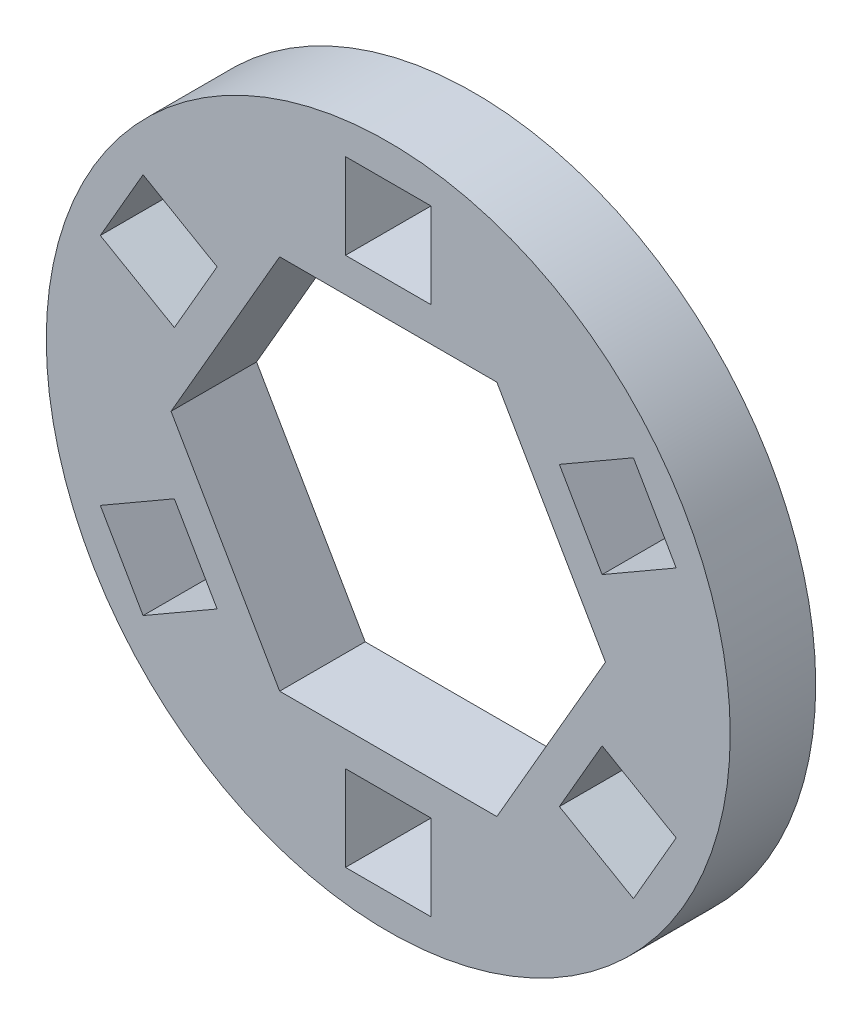
ISO-10303-21;
HEADER;
FILE_DESCRIPTION(('STEP AP214'),'2;1');
FILE_NAME('part.step','',(''),(''),'','','');
FILE_SCHEMA(('AUTOMOTIVE_DESIGN { 1 0 10303 214 1 1 1 1 }'));
ENDSEC;
DATA;
#1=APPLICATION_CONTEXT('core data for automotive mechanical design processes');
#2=APPLICATION_PROTOCOL_DEFINITION('international standard','automotive_design',2000,#1);
#3=PRODUCT_CONTEXT('',#1,'mechanical');
#4=PRODUCT('Part','Part','',(#3));
#5=PRODUCT_RELATED_PRODUCT_CATEGORY('part','',(#4));
#6=PRODUCT_DEFINITION_FORMATION('','',#4);
#7=PRODUCT_DEFINITION_CONTEXT('part definition',#1,'design');
#8=PRODUCT_DEFINITION('design','',#6,#7);
#9=PRODUCT_DEFINITION_SHAPE('','',#8);
#10=(LENGTH_UNIT() NAMED_UNIT(*) SI_UNIT(.MILLI.,.METRE.));
#11=(NAMED_UNIT(*) PLANE_ANGLE_UNIT() SI_UNIT($,.RADIAN.));
#12=(NAMED_UNIT(*) SI_UNIT($,.STERADIAN.) SOLID_ANGLE_UNIT());
#13=UNCERTAINTY_MEASURE_WITH_UNIT(LENGTH_MEASURE(1.E-05),#10,'distance_accuracy_value','');
#14=(GEOMETRIC_REPRESENTATION_CONTEXT(3) GLOBAL_UNCERTAINTY_ASSIGNED_CONTEXT((#13)) GLOBAL_UNIT_ASSIGNED_CONTEXT((#10,
#11,#12)) REPRESENTATION_CONTEXT('',''));
#15=CARTESIAN_POINT('',(0.,0.,0.));
#16=DIRECTION('',(0.,0.,1.));
#17=DIRECTION('',(1.,0.,0.));
#18=AXIS2_PLACEMENT_3D('',#15,#16,#17);
#19=CARTESIAN_POINT('',(0.,0.,5.));
#20=DIRECTION('',(0.,0.,1.));
#21=DIRECTION('',(1.,0.,0.));
#22=AXIS2_PLACEMENT_3D('',#19,#20,#21);
#23=PLANE('',#22);
#24=CARTESIAN_POINT('',(0.,0.,5.));
#25=DIRECTION('',(0.,0.,1.));
#26=DIRECTION('',(1.,0.,0.));
#27=AXIS2_PLACEMENT_3D('',#24,#25,#26);
#28=CIRCLE('',#27,20.);
#29=CARTESIAN_POINT('',(20.,0.,5.));
#30=VERTEX_POINT('',#29);
#31=EDGE_CURVE('E11',#30,#30,#28,.T.);
#32=ORIENTED_EDGE('',*,*,#31,.T.);
#33=EDGE_LOOP('',(#32));
#34=FACE_BOUND('',#33,.T.);
#35=DIRECTION('',(-0.5,0.866025403784438,0.));
#36=VECTOR('',#35,1.);
#37=CARTESIAN_POINT('',(12.7017059221718,0.,5.));
#38=LINE('',#37,#36);
#39=CARTESIAN_POINT('',(12.7017059221718,0.,5.));
#40=VERTEX_POINT('',#39);
#41=CARTESIAN_POINT('',(6.35085296108588,11.,5.));
#42=VERTEX_POINT('',#41);
#43=EDGE_CURVE('E422',#40,#42,#38,.T.);
#44=ORIENTED_EDGE('',*,*,#43,.F.);
#45=DIRECTION('',(0.5,0.866025403784439,0.));
#46=VECTOR('',#45,1.);
#47=CARTESIAN_POINT('',(6.35085296108588,-11.,5.));
#48=LINE('',#47,#46);
#49=CARTESIAN_POINT('',(6.35085296108588,-11.,5.));
#50=VERTEX_POINT('',#49);
#51=EDGE_CURVE('E420',#50,#40,#48,.T.);
#52=ORIENTED_EDGE('',*,*,#51,.F.);
#53=DIRECTION('',(1.,0.,0.));
#54=VECTOR('',#53,1.);
#55=CARTESIAN_POINT('',(-6.35085296108588,-11.,5.));
#56=LINE('',#55,#54);
#57=CARTESIAN_POINT('',(-6.35085296108588,-11.,5.));
#58=VERTEX_POINT('',#57);
#59=EDGE_CURVE('E432',#58,#50,#56,.T.);
#60=ORIENTED_EDGE('',*,*,#59,.F.);
#61=DIRECTION('',(0.5,-0.866025403784438,0.));
#62=VECTOR('',#61,1.);
#63=CARTESIAN_POINT('',(-12.7017059221718,0.,5.));
#64=LINE('',#63,#62);
#65=CARTESIAN_POINT('',(-12.7017059221718,0.,5.));
#66=VERTEX_POINT('',#65);
#67=EDGE_CURVE('E429',#66,#58,#64,.T.);
#68=ORIENTED_EDGE('',*,*,#67,.F.);
#69=DIRECTION('',(-0.5,-0.866025403784438,0.));
#70=VECTOR('',#69,1.);
#71=CARTESIAN_POINT('',(-6.35085296108588,11.,5.));
#72=LINE('',#71,#70);
#73=CARTESIAN_POINT('',(-6.35085296108588,11.,5.));
#74=VERTEX_POINT('',#73);
#75=EDGE_CURVE('E427',#74,#66,#72,.T.);
#76=ORIENTED_EDGE('',*,*,#75,.F.);
#77=DIRECTION('',(-1.,0.,0.));
#78=VECTOR('',#77,1.);
#79=CARTESIAN_POINT('',(6.35085296108588,11.,5.));
#80=LINE('',#79,#78);
#81=EDGE_CURVE('E425',#42,#74,#80,.T.);
#82=ORIENTED_EDGE('',*,*,#81,.F.);
#83=EDGE_LOOP('',(#44,#52,#60,#68,#76,#82));
#84=FACE_BOUND('',#83,.T.);
#85=DIRECTION('',(1.,0.,0.));
#86=VECTOR('',#85,1.);
#87=CARTESIAN_POINT('',(-2.5,13.,5.));
#88=LINE('',#87,#86);
#89=CARTESIAN_POINT('',(-2.5,13.,5.));
#90=VERTEX_POINT('',#89);
#91=CARTESIAN_POINT('',(2.5,13.,5.));
#92=VERTEX_POINT('',#91);
#93=EDGE_CURVE('E391',#90,#92,#88,.T.);
#94=ORIENTED_EDGE('',*,*,#93,.F.);
#95=DIRECTION('',(0.,-1.,0.));
#96=VECTOR('',#95,1.);
#97=CARTESIAN_POINT('',(-2.5,18.,5.));
#98=LINE('',#97,#96);
#99=CARTESIAN_POINT('',(-2.5,18.,5.));
#100=VERTEX_POINT('',#99);
#101=EDGE_CURVE('E389',#100,#90,#98,.T.);
#102=ORIENTED_EDGE('',*,*,#101,.F.);
#103=DIRECTION('',(-1.,0.,0.));
#104=VECTOR('',#103,1.);
#105=CARTESIAN_POINT('',(-2.5,18.,5.));
#106=LINE('',#105,#104);
#107=CARTESIAN_POINT('',(2.5,18.,5.));
#108=VERTEX_POINT('',#107);
#109=EDGE_CURVE('E397',#108,#100,#106,.T.);
#110=ORIENTED_EDGE('',*,*,#109,.F.);
#111=DIRECTION('',(0.,1.,0.));
#112=VECTOR('',#111,1.);
#113=CARTESIAN_POINT('',(2.5,18.,5.));
#114=LINE('',#113,#112);
#115=EDGE_CURVE('E394',#92,#108,#114,.T.);
#116=ORIENTED_EDGE('',*,*,#115,.F.);
#117=EDGE_LOOP('',(#94,#102,#110,#116));
#118=FACE_BOUND('',#117,.T.);
#119=DIRECTION('',(-0.866025403784439,-0.5,0.));
#120=VECTOR('',#119,1.);
#121=CARTESIAN_POINT('',(14.3384572681199,11.1650635094611,5.));
#122=LINE('',#121,#120);
#123=CARTESIAN_POINT('',(14.3384572681199,11.1650635094611,5.));
#124=VERTEX_POINT('',#123);
#125=CARTESIAN_POINT('',(10.0083302491977,8.6650635094611,5.));
#126=VERTEX_POINT('',#125);
#127=EDGE_CURVE('E360',#124,#126,#122,.T.);
#128=ORIENTED_EDGE('',*,*,#127,.F.);
#129=DIRECTION('',(-0.5,0.866025403784438,0.));
#130=VECTOR('',#129,1.);
#131=CARTESIAN_POINT('',(14.3384572681199,11.1650635094611,5.));
#132=LINE('',#131,#130);
#133=CARTESIAN_POINT('',(16.8384572681199,6.83493649053891,5.));
#134=VERTEX_POINT('',#133);
#135=EDGE_CURVE('E358',#134,#124,#132,.T.);
#136=ORIENTED_EDGE('',*,*,#135,.F.);
#137=DIRECTION('',(0.866025403784438,0.500000000000001,0.));
#138=VECTOR('',#137,1.);
#139=CARTESIAN_POINT('',(16.8384572681199,6.83493649053891,5.));
#140=LINE('',#139,#138);
#141=CARTESIAN_POINT('',(12.5083302491977,4.3349364905389,5.));
#142=VERTEX_POINT('',#141);
#143=EDGE_CURVE('E366',#142,#134,#140,.T.);
#144=ORIENTED_EDGE('',*,*,#143,.F.);
#145=DIRECTION('',(0.5,-0.866025403784438,0.));
#146=VECTOR('',#145,1.);
#147=CARTESIAN_POINT('',(10.0083302491977,8.6650635094611,5.));
#148=LINE('',#147,#146);
#149=EDGE_CURVE('E363',#126,#142,#148,.T.);
#150=ORIENTED_EDGE('',*,*,#149,.F.);
#151=EDGE_LOOP('',(#128,#136,#144,#150));
#152=FACE_BOUND('',#151,.T.);
#153=DIRECTION('',(-0.866025403784439,0.5,0.));
#154=VECTOR('',#153,1.);
#155=CARTESIAN_POINT('',(16.8384572681199,-6.8349364905389,5.));
#156=LINE('',#155,#154);
#157=CARTESIAN_POINT('',(16.8384572681199,-6.8349364905389,5.));
#158=VERTEX_POINT('',#157);
#159=CARTESIAN_POINT('',(12.5083302491977,-4.3349364905389,5.));
#160=VERTEX_POINT('',#159);
#161=EDGE_CURVE('E329',#158,#160,#156,.T.);
#162=ORIENTED_EDGE('',*,*,#161,.F.);
#163=DIRECTION('',(0.5,0.866025403784439,0.));
#164=VECTOR('',#163,1.);
#165=CARTESIAN_POINT('',(16.8384572681199,-6.8349364905389,5.));
#166=LINE('',#165,#164);
#167=CARTESIAN_POINT('',(14.3384572681199,-11.1650635094611,5.));
#168=VERTEX_POINT('',#167);
#169=EDGE_CURVE('E327',#168,#158,#166,.T.);
#170=ORIENTED_EDGE('',*,*,#169,.F.);
#171=DIRECTION('',(0.866025403784439,-0.499999999999999,0.));
#172=VECTOR('',#171,1.);
#173=CARTESIAN_POINT('',(14.3384572681199,-11.1650635094611,5.));
#174=LINE('',#173,#172);
#175=CARTESIAN_POINT('',(10.0083302491977,-8.6650635094611,5.));
#176=VERTEX_POINT('',#175);
#177=EDGE_CURVE('E335',#176,#168,#174,.T.);
#178=ORIENTED_EDGE('',*,*,#177,.F.);
#179=DIRECTION('',(-0.5,-0.866025403784439,0.));
#180=VECTOR('',#179,1.);
#181=CARTESIAN_POINT('',(12.5083302491977,-4.3349364905389,5.));
#182=LINE('',#181,#180);
#183=EDGE_CURVE('E332',#160,#176,#182,.T.);
#184=ORIENTED_EDGE('',*,*,#183,.F.);
#185=EDGE_LOOP('',(#162,#170,#178,#184));
#186=FACE_BOUND('',#185,.T.);
#187=DIRECTION('',(0.,1.,0.));
#188=VECTOR('',#187,1.);
#189=CARTESIAN_POINT('',(2.5,-18.,5.));
#190=LINE('',#189,#188);
#191=CARTESIAN_POINT('',(2.5,-18.,5.));
#192=VERTEX_POINT('',#191);
#193=CARTESIAN_POINT('',(2.5,-13.,5.));
#194=VERTEX_POINT('',#193);
#195=EDGE_CURVE('E298',#192,#194,#190,.T.);
#196=ORIENTED_EDGE('',*,*,#195,.F.);
#197=DIRECTION('',(1.,0.,0.));
#198=VECTOR('',#197,1.);
#199=CARTESIAN_POINT('',(2.5,-18.,5.));
#200=LINE('',#199,#198);
#201=CARTESIAN_POINT('',(-2.5,-18.,5.));
#202=VERTEX_POINT('',#201);
#203=EDGE_CURVE('E296',#202,#192,#200,.T.);
#204=ORIENTED_EDGE('',*,*,#203,.F.);
#205=DIRECTION('',(0.,-1.,0.));
#206=VECTOR('',#205,1.);
#207=CARTESIAN_POINT('',(-2.5,-18.,5.));
#208=LINE('',#207,#206);
#209=CARTESIAN_POINT('',(-2.5,-13.,5.));
#210=VERTEX_POINT('',#209);
#211=EDGE_CURVE('E304',#210,#202,#208,.T.);
#212=ORIENTED_EDGE('',*,*,#211,.F.);
#213=DIRECTION('',(-1.,0.,0.));
#214=VECTOR('',#213,1.);
#215=CARTESIAN_POINT('',(2.5,-13.,5.));
#216=LINE('',#215,#214);
#217=EDGE_CURVE('E301',#194,#210,#216,.T.);
#218=ORIENTED_EDGE('',*,*,#217,.F.);
#219=EDGE_LOOP('',(#196,#204,#212,#218));
#220=FACE_BOUND('',#219,.T.);
#221=DIRECTION('',(0.866025403784438,0.5,0.));
#222=VECTOR('',#221,1.);
#223=CARTESIAN_POINT('',(-14.3384572681199,-11.1650635094611,5.));
#224=LINE('',#223,#222);
#225=CARTESIAN_POINT('',(-14.3384572681199,-11.1650635094611,5.));
#226=VERTEX_POINT('',#225);
#227=CARTESIAN_POINT('',(-10.0083302491977,-8.6650635094611,5.));
#228=VERTEX_POINT('',#227);
#229=EDGE_CURVE('E267',#226,#228,#224,.T.);
#230=ORIENTED_EDGE('',*,*,#229,.F.);
#231=DIRECTION('',(0.5,-0.866025403784438,0.));
#232=VECTOR('',#231,1.);
#233=CARTESIAN_POINT('',(-14.3384572681199,-11.1650635094611,5.));
#234=LINE('',#233,#232);
#235=CARTESIAN_POINT('',(-16.8384572681199,-6.83493649053891,5.));
#236=VERTEX_POINT('',#235);
#237=EDGE_CURVE('E265',#236,#226,#234,.T.);
#238=ORIENTED_EDGE('',*,*,#237,.F.);
#239=DIRECTION('',(-0.866025403784438,-0.500000000000001,0.));
#240=VECTOR('',#239,1.);
#241=CARTESIAN_POINT('',(-16.8384572681199,-6.83493649053891,5.));
#242=LINE('',#241,#240);
#243=CARTESIAN_POINT('',(-12.5083302491977,-4.33493649053891,5.));
#244=VERTEX_POINT('',#243);
#245=EDGE_CURVE('E273',#244,#236,#242,.T.);
#246=ORIENTED_EDGE('',*,*,#245,.F.);
#247=DIRECTION('',(-0.5,0.866025403784438,0.));
#248=VECTOR('',#247,1.);
#249=CARTESIAN_POINT('',(-10.0083302491977,-8.6650635094611,5.));
#250=LINE('',#249,#248);
#251=EDGE_CURVE('E270',#228,#244,#250,.T.);
#252=ORIENTED_EDGE('',*,*,#251,.F.);
#253=EDGE_LOOP('',(#230,#238,#246,#252));
#254=FACE_BOUND('',#253,.T.);
#255=DIRECTION('',(0.866025403784439,-0.499999999999999,0.));
#256=VECTOR('',#255,1.);
#257=CARTESIAN_POINT('',(-16.8384572681199,6.83493649053889,5.));
#258=LINE('',#257,#256);
#259=CARTESIAN_POINT('',(-16.8384572681199,6.83493649053889,5.));
#260=VERTEX_POINT('',#259);
#261=CARTESIAN_POINT('',(-12.5083302491977,4.33493649053889,5.));
#262=VERTEX_POINT('',#261);
#263=EDGE_CURVE('E237',#260,#262,#258,.T.);
#264=ORIENTED_EDGE('',*,*,#263,.F.);
#265=DIRECTION('',(-0.499999999999999,-0.866025403784439,0.));
#266=VECTOR('',#265,1.);
#267=CARTESIAN_POINT('',(-16.8384572681199,6.83493649053889,5.));
#268=LINE('',#267,#266);
#269=CARTESIAN_POINT('',(-14.3384572681199,11.1650635094611,5.));
#270=VERTEX_POINT('',#269);
#271=EDGE_CURVE('E229',#270,#260,#268,.T.);
#272=ORIENTED_EDGE('',*,*,#271,.F.);
#273=DIRECTION('',(-0.86602540378444,0.499999999999999,0.));
#274=VECTOR('',#273,1.);
#275=CARTESIAN_POINT('',(-14.3384572681199,11.1650635094611,5.));
#276=LINE('',#275,#274);
#277=CARTESIAN_POINT('',(-10.0083302491977,8.66506350946109,5.));
#278=VERTEX_POINT('',#277);
#279=EDGE_CURVE('E251',#278,#270,#276,.T.);
#280=ORIENTED_EDGE('',*,*,#279,.F.);
#281=DIRECTION('',(0.499999999999999,0.866025403784439,0.));
#282=VECTOR('',#281,1.);
#283=CARTESIAN_POINT('',(-12.5083302491977,4.33493649053889,5.));
#284=LINE('',#283,#282);
#285=EDGE_CURVE('E249',#262,#278,#284,.T.);
#286=ORIENTED_EDGE('',*,*,#285,.F.);
#287=EDGE_LOOP('',(#264,#272,#280,#286));
#288=FACE_BOUND('',#287,.T.);
#289=ADVANCED_FACE('F32',(#34,#84,#118,#152,#186,#220,#254,#288),#23,.T.);
#290=CARTESIAN_POINT('',(0.,0.,0.));
#291=DIRECTION('',(0.,0.,1.));
#292=DIRECTION('',(1.,0.,0.));
#293=AXIS2_PLACEMENT_3D('',#290,#291,#292);
#294=PLANE('',#293);
#295=DIRECTION('',(0.5,-0.866025403784438,0.));
#296=VECTOR('',#295,1.);
#297=CARTESIAN_POINT('',(-14.3384572681199,-11.1650635094611,0.));
#298=LINE('',#297,#296);
#299=CARTESIAN_POINT('',(-16.8384572681199,-6.83493649053891,0.));
#300=VERTEX_POINT('',#299);
#301=CARTESIAN_POINT('',(-14.3384572681199,-11.1650635094611,0.));
#302=VERTEX_POINT('',#301);
#303=EDGE_CURVE('E245',#300,#302,#298,.T.);
#304=ORIENTED_EDGE('',*,*,#303,.T.);
#305=DIRECTION('',(0.866025403784438,0.5,0.));
#306=VECTOR('',#305,1.);
#307=CARTESIAN_POINT('',(-14.3384572681199,-11.1650635094611,0.));
#308=LINE('',#307,#306);
#309=CARTESIAN_POINT('',(-10.0083302491977,-8.6650635094611,0.));
#310=VERTEX_POINT('',#309);
#311=EDGE_CURVE('E278',#302,#310,#308,.T.);
#312=ORIENTED_EDGE('',*,*,#311,.T.);
#313=DIRECTION('',(-0.5,0.866025403784438,0.));
#314=VECTOR('',#313,1.);
#315=CARTESIAN_POINT('',(-10.0083302491977,-8.6650635094611,0.));
#316=LINE('',#315,#314);
#317=CARTESIAN_POINT('',(-12.5083302491977,-4.33493649053891,0.));
#318=VERTEX_POINT('',#317);
#319=EDGE_CURVE('E281',#310,#318,#316,.T.);
#320=ORIENTED_EDGE('',*,*,#319,.T.);
#321=DIRECTION('',(-0.866025403784438,-0.500000000000001,0.));
#322=VECTOR('',#321,1.);
#323=CARTESIAN_POINT('',(-16.8384572681199,-6.83493649053891,0.));
#324=LINE('',#323,#322);
#325=EDGE_CURVE('E268',#318,#300,#324,.T.);
#326=ORIENTED_EDGE('',*,*,#325,.T.);
#327=EDGE_LOOP('',(#304,#312,#320,#326));
#328=FACE_BOUND('',#327,.T.);
#329=DIRECTION('',(0.5,0.866025403784439,0.));
#330=VECTOR('',#329,1.);
#331=CARTESIAN_POINT('',(16.8384572681199,-6.8349364905389,0.));
#332=LINE('',#331,#330);
#333=CARTESIAN_POINT('',(14.3384572681199,-11.1650635094611,0.));
#334=VERTEX_POINT('',#333);
#335=CARTESIAN_POINT('',(16.8384572681199,-6.8349364905389,0.));
#336=VERTEX_POINT('',#335);
#337=EDGE_CURVE('E326',#334,#336,#332,.T.);
#338=ORIENTED_EDGE('',*,*,#337,.T.);
#339=DIRECTION('',(-0.866025403784439,0.5,0.));
#340=VECTOR('',#339,1.);
#341=CARTESIAN_POINT('',(16.8384572681199,-6.8349364905389,0.));
#342=LINE('',#341,#340);
#343=CARTESIAN_POINT('',(12.5083302491977,-4.3349364905389,0.));
#344=VERTEX_POINT('',#343);
#345=EDGE_CURVE('E340',#336,#344,#342,.T.);
#346=ORIENTED_EDGE('',*,*,#345,.T.);
#347=DIRECTION('',(-0.5,-0.866025403784439,0.));
#348=VECTOR('',#347,1.);
#349=CARTESIAN_POINT('',(12.5083302491977,-4.3349364905389,0.));
#350=LINE('',#349,#348);
#351=CARTESIAN_POINT('',(10.0083302491977,-8.6650635094611,0.));
#352=VERTEX_POINT('',#351);
#353=EDGE_CURVE('E343',#344,#352,#350,.T.);
#354=ORIENTED_EDGE('',*,*,#353,.T.);
#355=DIRECTION('',(0.866025403784439,-0.499999999999999,0.));
#356=VECTOR('',#355,1.);
#357=CARTESIAN_POINT('',(14.3384572681199,-11.1650635094611,0.));
#358=LINE('',#357,#356);
#359=EDGE_CURVE('E330',#352,#334,#358,.T.);
#360=ORIENTED_EDGE('',*,*,#359,.T.);
#361=EDGE_LOOP('',(#338,#346,#354,#360));
#362=FACE_BOUND('',#361,.T.);
#363=DIRECTION('',(0.,-1.,0.));
#364=VECTOR('',#363,1.);
#365=CARTESIAN_POINT('',(-2.5,18.,0.));
#366=LINE('',#365,#364);
#367=CARTESIAN_POINT('',(-2.5,18.,0.));
#368=VERTEX_POINT('',#367);
#369=CARTESIAN_POINT('',(-2.5,13.,0.));
#370=VERTEX_POINT('',#369);
#371=EDGE_CURVE('E388',#368,#370,#366,.T.);
#372=ORIENTED_EDGE('',*,*,#371,.T.);
#373=DIRECTION('',(1.,0.,0.));
#374=VECTOR('',#373,1.);
#375=CARTESIAN_POINT('',(-2.5,13.,0.));
#376=LINE('',#375,#374);
#377=CARTESIAN_POINT('',(2.5,13.,0.));
#378=VERTEX_POINT('',#377);
#379=EDGE_CURVE('E402',#370,#378,#376,.T.);
#380=ORIENTED_EDGE('',*,*,#379,.T.);
#381=DIRECTION('',(0.,1.,0.));
#382=VECTOR('',#381,1.);
#383=CARTESIAN_POINT('',(2.5,18.,0.));
#384=LINE('',#383,#382);
#385=CARTESIAN_POINT('',(2.5,18.,0.));
#386=VERTEX_POINT('',#385);
#387=EDGE_CURVE('E405',#378,#386,#384,.T.);
#388=ORIENTED_EDGE('',*,*,#387,.T.);
#389=DIRECTION('',(-1.,0.,0.));
#390=VECTOR('',#389,1.);
#391=CARTESIAN_POINT('',(-2.5,18.,0.));
#392=LINE('',#391,#390);
#393=EDGE_CURVE('E392',#386,#368,#392,.T.);
#394=ORIENTED_EDGE('',*,*,#393,.T.);
#395=EDGE_LOOP('',(#372,#380,#388,#394));
#396=FACE_BOUND('',#395,.T.);
#397=CARTESIAN_POINT('',(0.,0.,0.));
#398=DIRECTION('',(0.,0.,1.));
#399=DIRECTION('',(1.,0.,0.));
#400=AXIS2_PLACEMENT_3D('',#397,#398,#399);
#401=CIRCLE('',#400,20.);
#402=CARTESIAN_POINT('',(20.,0.,0.));
#403=VERTEX_POINT('',#402);
#404=EDGE_CURVE('E36',#403,#403,#401,.T.);
#405=ORIENTED_EDGE('',*,*,#404,.F.);
#406=EDGE_LOOP('',(#405));
#407=FACE_BOUND('',#406,.T.);
#408=DIRECTION('',(0.5,0.866025403784439,0.));
#409=VECTOR('',#408,1.);
#410=CARTESIAN_POINT('',(6.35085296108588,-11.,0.));
#411=LINE('',#410,#409);
#412=CARTESIAN_POINT('',(6.35085296108588,-11.,0.));
#413=VERTEX_POINT('',#412);
#414=CARTESIAN_POINT('',(12.7017059221718,0.,0.));
#415=VERTEX_POINT('',#414);
#416=EDGE_CURVE('E419',#413,#415,#411,.T.);
#417=ORIENTED_EDGE('',*,*,#416,.T.);
#418=DIRECTION('',(-0.5,0.866025403784438,0.));
#419=VECTOR('',#418,1.);
#420=CARTESIAN_POINT('',(12.7017059221718,0.,0.));
#421=LINE('',#420,#419);
#422=CARTESIAN_POINT('',(6.35085296108588,11.,0.));
#423=VERTEX_POINT('',#422);
#424=EDGE_CURVE('E437',#415,#423,#421,.T.);
#425=ORIENTED_EDGE('',*,*,#424,.T.);
#426=DIRECTION('',(-1.,0.,0.));
#427=VECTOR('',#426,1.);
#428=CARTESIAN_POINT('',(6.35085296108588,11.,0.));
#429=LINE('',#428,#427);
#430=CARTESIAN_POINT('',(-6.35085296108588,11.,0.));
#431=VERTEX_POINT('',#430);
#432=EDGE_CURVE('E440',#423,#431,#429,.T.);
#433=ORIENTED_EDGE('',*,*,#432,.T.);
#434=DIRECTION('',(-0.5,-0.866025403784438,0.));
#435=VECTOR('',#434,1.);
#436=CARTESIAN_POINT('',(-6.35085296108588,11.,0.));
#437=LINE('',#436,#435);
#438=CARTESIAN_POINT('',(-12.7017059221718,0.,0.));
#439=VERTEX_POINT('',#438);
#440=EDGE_CURVE('E443',#431,#439,#437,.T.);
#441=ORIENTED_EDGE('',*,*,#440,.T.);
#442=DIRECTION('',(0.5,-0.866025403784438,0.));
#443=VECTOR('',#442,1.);
#444=CARTESIAN_POINT('',(-12.7017059221718,0.,0.));
#445=LINE('',#444,#443);
#446=CARTESIAN_POINT('',(-6.35085296108588,-11.,0.));
#447=VERTEX_POINT('',#446);
#448=EDGE_CURVE('E446',#439,#447,#445,.T.);
#449=ORIENTED_EDGE('',*,*,#448,.T.);
#450=DIRECTION('',(1.,0.,0.));
#451=VECTOR('',#450,1.);
#452=CARTESIAN_POINT('',(-6.35085296108588,-11.,0.));
#453=LINE('',#452,#451);
#454=EDGE_CURVE('E423',#447,#413,#453,.T.);
#455=ORIENTED_EDGE('',*,*,#454,.T.);
#456=EDGE_LOOP('',(#417,#425,#433,#441,#449,#455));
#457=FACE_BOUND('',#456,.T.);
#458=DIRECTION('',(-0.5,0.866025403784438,0.));
#459=VECTOR('',#458,1.);
#460=CARTESIAN_POINT('',(14.3384572681199,11.1650635094611,0.));
#461=LINE('',#460,#459);
#462=CARTESIAN_POINT('',(16.8384572681199,6.83493649053891,0.));
#463=VERTEX_POINT('',#462);
#464=CARTESIAN_POINT('',(14.3384572681199,11.1650635094611,0.));
#465=VERTEX_POINT('',#464);
#466=EDGE_CURVE('E357',#463,#465,#461,.T.);
#467=ORIENTED_EDGE('',*,*,#466,.T.);
#468=DIRECTION('',(-0.866025403784439,-0.5,0.));
#469=VECTOR('',#468,1.);
#470=CARTESIAN_POINT('',(14.3384572681199,11.1650635094611,0.));
#471=LINE('',#470,#469);
#472=CARTESIAN_POINT('',(10.0083302491977,8.6650635094611,0.));
#473=VERTEX_POINT('',#472);
#474=EDGE_CURVE('E371',#465,#473,#471,.T.);
#475=ORIENTED_EDGE('',*,*,#474,.T.);
#476=DIRECTION('',(0.5,-0.866025403784438,0.));
#477=VECTOR('',#476,1.);
#478=CARTESIAN_POINT('',(10.0083302491977,8.6650635094611,0.));
#479=LINE('',#478,#477);
#480=CARTESIAN_POINT('',(12.5083302491977,4.3349364905389,0.));
#481=VERTEX_POINT('',#480);
#482=EDGE_CURVE('E374',#473,#481,#479,.T.);
#483=ORIENTED_EDGE('',*,*,#482,.T.);
#484=DIRECTION('',(0.866025403784438,0.500000000000001,0.));
#485=VECTOR('',#484,1.);
#486=CARTESIAN_POINT('',(16.8384572681199,6.83493649053891,0.));
#487=LINE('',#486,#485);
#488=EDGE_CURVE('E361',#481,#463,#487,.T.);
#489=ORIENTED_EDGE('',*,*,#488,.T.);
#490=EDGE_LOOP('',(#467,#475,#483,#489));
#491=FACE_BOUND('',#490,.T.);
#492=DIRECTION('',(1.,0.,0.));
#493=VECTOR('',#492,1.);
#494=CARTESIAN_POINT('',(2.5,-18.,0.));
#495=LINE('',#494,#493);
#496=CARTESIAN_POINT('',(-2.5,-18.,0.));
#497=VERTEX_POINT('',#496);
#498=CARTESIAN_POINT('',(2.5,-18.,0.));
#499=VERTEX_POINT('',#498);
#500=EDGE_CURVE('E295',#497,#499,#495,.T.);
#501=ORIENTED_EDGE('',*,*,#500,.T.);
#502=DIRECTION('',(0.,1.,0.));
#503=VECTOR('',#502,1.);
#504=CARTESIAN_POINT('',(2.5,-18.,0.));
#505=LINE('',#504,#503);
#506=CARTESIAN_POINT('',(2.5,-13.,0.));
#507=VERTEX_POINT('',#506);
#508=EDGE_CURVE('E309',#499,#507,#505,.T.);
#509=ORIENTED_EDGE('',*,*,#508,.T.);
#510=DIRECTION('',(-1.,0.,0.));
#511=VECTOR('',#510,1.);
#512=CARTESIAN_POINT('',(2.5,-13.,0.));
#513=LINE('',#512,#511);
#514=CARTESIAN_POINT('',(-2.5,-13.,0.));
#515=VERTEX_POINT('',#514);
#516=EDGE_CURVE('E312',#507,#515,#513,.T.);
#517=ORIENTED_EDGE('',*,*,#516,.T.);
#518=DIRECTION('',(0.,-1.,0.));
#519=VECTOR('',#518,1.);
#520=CARTESIAN_POINT('',(-2.5,-18.,0.));
#521=LINE('',#520,#519);
#522=EDGE_CURVE('E299',#515,#497,#521,.T.);
#523=ORIENTED_EDGE('',*,*,#522,.T.);
#524=EDGE_LOOP('',(#501,#509,#517,#523));
#525=FACE_BOUND('',#524,.T.);
#526=DIRECTION('',(-0.499999999999999,-0.866025403784439,0.));
#527=VECTOR('',#526,1.);
#528=CARTESIAN_POINT('',(-16.8384572681199,6.83493649053889,0.));
#529=LINE('',#528,#527);
#530=CARTESIAN_POINT('',(-14.3384572681199,11.1650635094611,0.));
#531=VERTEX_POINT('',#530);
#532=CARTESIAN_POINT('',(-16.8384572681199,6.83493649053889,0.));
#533=VERTEX_POINT('',#532);
#534=EDGE_CURVE('E55',#531,#533,#529,.T.);
#535=ORIENTED_EDGE('',*,*,#534,.T.);
#536=DIRECTION('',(0.866025403784439,-0.499999999999999,0.));
#537=VECTOR('',#536,1.);
#538=CARTESIAN_POINT('',(-16.8384572681199,6.83493649053889,0.));
#539=LINE('',#538,#537);
#540=CARTESIAN_POINT('',(-12.5083302491977,4.33493649053889,0.));
#541=VERTEX_POINT('',#540);
#542=EDGE_CURVE('E244',#533,#541,#539,.T.);
#543=ORIENTED_EDGE('',*,*,#542,.T.);
#544=DIRECTION('',(0.499999999999999,0.866025403784439,0.));
#545=VECTOR('',#544,1.);
#546=CARTESIAN_POINT('',(-12.5083302491977,4.33493649053889,0.));
#547=LINE('',#546,#545);
#548=CARTESIAN_POINT('',(-10.0083302491977,8.66506350946109,0.));
#549=VERTEX_POINT('',#548);
#550=EDGE_CURVE('E257',#541,#549,#547,.T.);
#551=ORIENTED_EDGE('',*,*,#550,.T.);
#552=DIRECTION('',(-0.86602540378444,0.499999999999999,0.));
#553=VECTOR('',#552,1.);
#554=CARTESIAN_POINT('',(-14.3384572681199,11.1650635094611,0.));
#555=LINE('',#554,#553);
#556=EDGE_CURVE('E238',#549,#531,#555,.T.);
#557=ORIENTED_EDGE('',*,*,#556,.T.);
#558=EDGE_LOOP('',(#535,#543,#551,#557));
#559=FACE_BOUND('',#558,.T.);
#560=ADVANCED_FACE('F469',(#328,#362,#396,#407,#457,#491,#525,#559),#294,.F.);
#561=CARTESIAN_POINT('',(0.,0.,5.));
#562=DIRECTION('',(0.,0.,-1.));
#563=DIRECTION('',(-1.,0.,0.));
#564=AXIS2_PLACEMENT_3D('',#561,#562,#563);
#565=CYLINDRICAL_SURFACE('',#564,20.);
#566=ORIENTED_EDGE('',*,*,#31,.F.);
#567=EDGE_LOOP('',(#566));
#568=FACE_BOUND('',#567,.T.);
#569=ORIENTED_EDGE('',*,*,#404,.T.);
#570=EDGE_LOOP('',(#569));
#571=FACE_BOUND('',#570,.T.);
#572=ADVANCED_FACE('F34',(#568,#571),#565,.T.);
#573=CARTESIAN_POINT('',(6.35085296108588,-11.,5.));
#574=DIRECTION('',(-0.866025403784439,0.5,0.));
#575=DIRECTION('',(-0.5,-0.866025403784439,0.));
#576=AXIS2_PLACEMENT_3D('',#573,#574,#575);
#577=PLANE('',#576);
#578=ORIENTED_EDGE('',*,*,#416,.F.);
#579=DIRECTION('',(0.,0.,-1.));
#580=VECTOR('',#579,1.);
#581=CARTESIAN_POINT('',(6.35085296108588,-11.,5.));
#582=LINE('',#581,#580);
#583=EDGE_CURVE('E434',#50,#413,#582,.T.);
#584=ORIENTED_EDGE('',*,*,#583,.F.);
#585=ORIENTED_EDGE('',*,*,#51,.T.);
#586=DIRECTION('',(0.,0.,-1.));
#587=VECTOR('',#586,1.);
#588=CARTESIAN_POINT('',(12.7017059221718,0.,5.));
#589=LINE('',#588,#587);
#590=EDGE_CURVE('E461',#40,#415,#589,.T.);
#591=ORIENTED_EDGE('',*,*,#590,.T.);
#592=EDGE_LOOP('',(#578,#584,#585,#591));
#593=FACE_BOUND('',#592,.T.);
#594=ADVANCED_FACE('F493',(#593),#577,.T.);
#595=CARTESIAN_POINT('',(12.7017059221718,0.,5.));
#596=DIRECTION('',(-0.866025403784438,-0.5,0.));
#597=DIRECTION('',(0.5,-0.866025403784438,0.));
#598=AXIS2_PLACEMENT_3D('',#595,#596,#597);
#599=PLANE('',#598);
#600=ORIENTED_EDGE('',*,*,#424,.F.);
#601=ORIENTED_EDGE('',*,*,#590,.F.);
#602=ORIENTED_EDGE('',*,*,#43,.T.);
#603=DIRECTION('',(0.,0.,-1.));
#604=VECTOR('',#603,1.);
#605=CARTESIAN_POINT('',(6.35085296108588,11.,5.));
#606=LINE('',#605,#604);
#607=EDGE_CURVE('E459',#42,#423,#606,.T.);
#608=ORIENTED_EDGE('',*,*,#607,.T.);
#609=EDGE_LOOP('',(#600,#601,#602,#608));
#610=FACE_BOUND('',#609,.T.);
#611=ADVANCED_FACE('F496',(#610),#599,.T.);
#612=CARTESIAN_POINT('',(6.35085296108588,11.,5.));
#613=DIRECTION('',(0.,-1.,0.));
#614=DIRECTION('',(0.,0.,-1.));
#615=AXIS2_PLACEMENT_3D('',#612,#613,#614);
#616=PLANE('',#615);
#617=ORIENTED_EDGE('',*,*,#432,.F.);
#618=ORIENTED_EDGE('',*,*,#607,.F.);
#619=ORIENTED_EDGE('',*,*,#81,.T.);
#620=DIRECTION('',(0.,0.,-1.));
#621=VECTOR('',#620,1.);
#622=CARTESIAN_POINT('',(-6.35085296108588,11.,5.));
#623=LINE('',#622,#621);
#624=EDGE_CURVE('E457',#74,#431,#623,.T.);
#625=ORIENTED_EDGE('',*,*,#624,.T.);
#626=EDGE_LOOP('',(#617,#618,#619,#625));
#627=FACE_BOUND('',#626,.T.);
#628=ADVANCED_FACE('F499',(#627),#616,.T.);
#629=CARTESIAN_POINT('',(-6.35085296108588,11.,5.));
#630=DIRECTION('',(0.866025403784439,-0.5,0.));
#631=DIRECTION('',(0.5,0.866025403784439,0.));
#632=AXIS2_PLACEMENT_3D('',#629,#630,#631);
#633=PLANE('',#632);
#634=ORIENTED_EDGE('',*,*,#440,.F.);
#635=ORIENTED_EDGE('',*,*,#624,.F.);
#636=ORIENTED_EDGE('',*,*,#75,.T.);
#637=DIRECTION('',(0.,0.,-1.));
#638=VECTOR('',#637,1.);
#639=CARTESIAN_POINT('',(-12.7017059221718,0.,5.));
#640=LINE('',#639,#638);
#641=EDGE_CURVE('E455',#66,#439,#640,.T.);
#642=ORIENTED_EDGE('',*,*,#641,.T.);
#643=EDGE_LOOP('',(#634,#635,#636,#642));
#644=FACE_BOUND('',#643,.T.);
#645=ADVANCED_FACE('F503',(#644),#633,.T.);
#646=CARTESIAN_POINT('',(-12.7017059221718,0.,5.));
#647=DIRECTION('',(0.866025403784438,0.5,0.));
#648=DIRECTION('',(-0.5,0.866025403784438,0.));
#649=AXIS2_PLACEMENT_3D('',#646,#647,#648);
#650=PLANE('',#649);
#651=ORIENTED_EDGE('',*,*,#448,.F.);
#652=ORIENTED_EDGE('',*,*,#641,.F.);
#653=ORIENTED_EDGE('',*,*,#67,.T.);
#654=DIRECTION('',(0.,0.,-1.));
#655=VECTOR('',#654,1.);
#656=CARTESIAN_POINT('',(-6.35085296108588,-11.,5.));
#657=LINE('',#656,#655);
#658=EDGE_CURVE('E453',#58,#447,#657,.T.);
#659=ORIENTED_EDGE('',*,*,#658,.T.);
#660=EDGE_LOOP('',(#651,#652,#653,#659));
#661=FACE_BOUND('',#660,.T.);
#662=ADVANCED_FACE('F507',(#661),#650,.T.);
#663=CARTESIAN_POINT('',(-6.35085296108588,-11.,5.));
#664=DIRECTION('',(0.,1.,0.));
#665=DIRECTION('',(0.,0.,1.));
#666=AXIS2_PLACEMENT_3D('',#663,#664,#665);
#667=PLANE('',#666);
#668=ORIENTED_EDGE('',*,*,#454,.F.);
#669=ORIENTED_EDGE('',*,*,#658,.F.);
#670=ORIENTED_EDGE('',*,*,#59,.T.);
#671=ORIENTED_EDGE('',*,*,#583,.T.);
#672=EDGE_LOOP('',(#668,#669,#670,#671));
#673=FACE_BOUND('',#672,.T.);
#674=ADVANCED_FACE('F511',(#673),#667,.T.);
#675=CARTESIAN_POINT('',(-2.5,18.,5.));
#676=DIRECTION('',(1.,0.,0.));
#677=DIRECTION('',(0.,1.,0.));
#678=AXIS2_PLACEMENT_3D('',#675,#676,#677);
#679=PLANE('',#678);
#680=ORIENTED_EDGE('',*,*,#371,.F.);
#681=DIRECTION('',(0.,0.,-1.));
#682=VECTOR('',#681,1.);
#683=CARTESIAN_POINT('',(-2.5,18.,5.));
#684=LINE('',#683,#682);
#685=EDGE_CURVE('E399',#100,#368,#684,.T.);
#686=ORIENTED_EDGE('',*,*,#685,.F.);
#687=ORIENTED_EDGE('',*,*,#101,.T.);
#688=DIRECTION('',(0.,0.,-1.));
#689=VECTOR('',#688,1.);
#690=CARTESIAN_POINT('',(-2.5,13.,5.));
#691=LINE('',#690,#689);
#692=EDGE_CURVE('E416',#90,#370,#691,.T.);
#693=ORIENTED_EDGE('',*,*,#692,.T.);
#694=EDGE_LOOP('',(#680,#686,#687,#693));
#695=FACE_BOUND('',#694,.T.);
#696=ADVANCED_FACE('F515',(#695),#679,.T.);
#697=CARTESIAN_POINT('',(-2.5,13.,5.));
#698=DIRECTION('',(0.,1.,0.));
#699=DIRECTION('',(0.,0.,1.));
#700=AXIS2_PLACEMENT_3D('',#697,#698,#699);
#701=PLANE('',#700);
#702=ORIENTED_EDGE('',*,*,#379,.F.);
#703=ORIENTED_EDGE('',*,*,#692,.F.);
#704=ORIENTED_EDGE('',*,*,#93,.T.);
#705=DIRECTION('',(0.,0.,-1.));
#706=VECTOR('',#705,1.);
#707=CARTESIAN_POINT('',(2.5,13.,5.));
#708=LINE('',#707,#706);
#709=EDGE_CURVE('E414',#92,#378,#708,.T.);
#710=ORIENTED_EDGE('',*,*,#709,.T.);
#711=EDGE_LOOP('',(#702,#703,#704,#710));
#712=FACE_BOUND('',#711,.T.);
#713=ADVANCED_FACE('F519',(#712),#701,.T.);
#714=CARTESIAN_POINT('',(2.5,18.,5.));
#715=DIRECTION('',(-1.,0.,0.));
#716=DIRECTION('',(0.,-1.,0.));
#717=AXIS2_PLACEMENT_3D('',#714,#715,#716);
#718=PLANE('',#717);
#719=ORIENTED_EDGE('',*,*,#387,.F.);
#720=ORIENTED_EDGE('',*,*,#709,.F.);
#721=ORIENTED_EDGE('',*,*,#115,.T.);
#722=DIRECTION('',(0.,0.,-1.));
#723=VECTOR('',#722,1.);
#724=CARTESIAN_POINT('',(2.5,18.,5.));
#725=LINE('',#724,#723);
#726=EDGE_CURVE('E412',#108,#386,#725,.T.);
#727=ORIENTED_EDGE('',*,*,#726,.T.);
#728=EDGE_LOOP('',(#719,#720,#721,#727));
#729=FACE_BOUND('',#728,.T.);
#730=ADVANCED_FACE('F523',(#729),#718,.T.);
#731=CARTESIAN_POINT('',(-2.5,18.,5.));
#732=DIRECTION('',(0.,-1.,0.));
#733=DIRECTION('',(0.,0.,-1.));
#734=AXIS2_PLACEMENT_3D('',#731,#732,#733);
#735=PLANE('',#734);
#736=ORIENTED_EDGE('',*,*,#393,.F.);
#737=ORIENTED_EDGE('',*,*,#726,.F.);
#738=ORIENTED_EDGE('',*,*,#109,.T.);
#739=ORIENTED_EDGE('',*,*,#685,.T.);
#740=EDGE_LOOP('',(#736,#737,#738,#739));
#741=FACE_BOUND('',#740,.T.);
#742=ADVANCED_FACE('F527',(#741),#735,.T.);
#743=CARTESIAN_POINT('',(14.3384572681199,11.1650635094611,5.));
#744=DIRECTION('',(-0.866025403784438,-0.5,0.));
#745=DIRECTION('',(0.5,-0.866025403784438,0.));
#746=AXIS2_PLACEMENT_3D('',#743,#744,#745);
#747=PLANE('',#746);
#748=ORIENTED_EDGE('',*,*,#466,.F.);
#749=DIRECTION('',(0.,0.,-1.));
#750=VECTOR('',#749,1.);
#751=CARTESIAN_POINT('',(16.8384572681199,6.83493649053891,5.));
#752=LINE('',#751,#750);
#753=EDGE_CURVE('E368',#134,#463,#752,.T.);
#754=ORIENTED_EDGE('',*,*,#753,.F.);
#755=ORIENTED_EDGE('',*,*,#135,.T.);
#756=DIRECTION('',(0.,0.,-1.));
#757=VECTOR('',#756,1.);
#758=CARTESIAN_POINT('',(14.3384572681199,11.1650635094611,5.));
#759=LINE('',#758,#757);
#760=EDGE_CURVE('E385',#124,#465,#759,.T.);
#761=ORIENTED_EDGE('',*,*,#760,.T.);
#762=EDGE_LOOP('',(#748,#754,#755,#761));
#763=FACE_BOUND('',#762,.T.);
#764=ADVANCED_FACE('F531',(#763),#747,.T.);
#765=CARTESIAN_POINT('',(14.3384572681199,11.1650635094611,5.));
#766=DIRECTION('',(0.5,-0.866025403784439,0.));
#767=DIRECTION('',(0.866025403784439,0.5,0.));
#768=AXIS2_PLACEMENT_3D('',#765,#766,#767);
#769=PLANE('',#768);
#770=ORIENTED_EDGE('',*,*,#474,.F.);
#771=ORIENTED_EDGE('',*,*,#760,.F.);
#772=ORIENTED_EDGE('',*,*,#127,.T.);
#773=DIRECTION('',(0.,0.,-1.));
#774=VECTOR('',#773,1.);
#775=CARTESIAN_POINT('',(10.0083302491977,8.6650635094611,5.));
#776=LINE('',#775,#774);
#777=EDGE_CURVE('E383',#126,#473,#776,.T.);
#778=ORIENTED_EDGE('',*,*,#777,.T.);
#779=EDGE_LOOP('',(#770,#771,#772,#778));
#780=FACE_BOUND('',#779,.T.);
#781=ADVANCED_FACE('F535',(#780),#769,.T.);
#782=CARTESIAN_POINT('',(10.0083302491977,8.6650635094611,5.));
#783=DIRECTION('',(0.866025403784439,0.5,0.));
#784=DIRECTION('',(-0.5,0.866025403784439,0.));
#785=AXIS2_PLACEMENT_3D('',#782,#783,#784);
#786=PLANE('',#785);
#787=ORIENTED_EDGE('',*,*,#482,.F.);
#788=ORIENTED_EDGE('',*,*,#777,.F.);
#789=ORIENTED_EDGE('',*,*,#149,.T.);
#790=DIRECTION('',(0.,0.,-1.));
#791=VECTOR('',#790,1.);
#792=CARTESIAN_POINT('',(12.5083302491977,4.3349364905389,5.));
#793=LINE('',#792,#791);
#794=EDGE_CURVE('E381',#142,#481,#793,.T.);
#795=ORIENTED_EDGE('',*,*,#794,.T.);
#796=EDGE_LOOP('',(#787,#788,#789,#795));
#797=FACE_BOUND('',#796,.T.);
#798=ADVANCED_FACE('F539',(#797),#786,.T.);
#799=CARTESIAN_POINT('',(16.8384572681199,6.83493649053891,5.));
#800=DIRECTION('',(-0.500000000000001,0.866025403784438,0.));
#801=DIRECTION('',(-0.866025403784438,-0.500000000000001,0.));
#802=AXIS2_PLACEMENT_3D('',#799,#800,#801);
#803=PLANE('',#802);
#804=ORIENTED_EDGE('',*,*,#488,.F.);
#805=ORIENTED_EDGE('',*,*,#794,.F.);
#806=ORIENTED_EDGE('',*,*,#143,.T.);
#807=ORIENTED_EDGE('',*,*,#753,.T.);
#808=EDGE_LOOP('',(#804,#805,#806,#807));
#809=FACE_BOUND('',#808,.T.);
#810=ADVANCED_FACE('F543',(#809),#803,.T.);
#811=CARTESIAN_POINT('',(16.8384572681199,-6.8349364905389,5.));
#812=DIRECTION('',(-0.866025403784439,0.5,0.));
#813=DIRECTION('',(-0.5,-0.866025403784439,0.));
#814=AXIS2_PLACEMENT_3D('',#811,#812,#813);
#815=PLANE('',#814);
#816=ORIENTED_EDGE('',*,*,#337,.F.);
#817=DIRECTION('',(0.,0.,-1.));
#818=VECTOR('',#817,1.);
#819=CARTESIAN_POINT('',(14.3384572681199,-11.1650635094611,5.));
#820=LINE('',#819,#818);
#821=EDGE_CURVE('E337',#168,#334,#820,.T.);
#822=ORIENTED_EDGE('',*,*,#821,.F.);
#823=ORIENTED_EDGE('',*,*,#169,.T.);
#824=DIRECTION('',(0.,0.,-1.));
#825=VECTOR('',#824,1.);
#826=CARTESIAN_POINT('',(16.8384572681199,-6.8349364905389,5.));
#827=LINE('',#826,#825);
#828=EDGE_CURVE('E354',#158,#336,#827,.T.);
#829=ORIENTED_EDGE('',*,*,#828,.T.);
#830=EDGE_LOOP('',(#816,#822,#823,#829));
#831=FACE_BOUND('',#830,.T.);
#832=ADVANCED_FACE('F547',(#831),#815,.T.);
#833=CARTESIAN_POINT('',(16.8384572681199,-6.8349364905389,5.));
#834=DIRECTION('',(-0.5,-0.866025403784439,0.));
#835=DIRECTION('',(0.866025403784439,-0.5,0.));
#836=AXIS2_PLACEMENT_3D('',#833,#834,#835);
#837=PLANE('',#836);
#838=ORIENTED_EDGE('',*,*,#345,.F.);
#839=ORIENTED_EDGE('',*,*,#828,.F.);
#840=ORIENTED_EDGE('',*,*,#161,.T.);
#841=DIRECTION('',(0.,0.,-1.));
#842=VECTOR('',#841,1.);
#843=CARTESIAN_POINT('',(12.5083302491977,-4.3349364905389,5.));
#844=LINE('',#843,#842);
#845=EDGE_CURVE('E352',#160,#344,#844,.T.);
#846=ORIENTED_EDGE('',*,*,#845,.T.);
#847=EDGE_LOOP('',(#838,#839,#840,#846));
#848=FACE_BOUND('',#847,.T.);
#849=ADVANCED_FACE('F551',(#848),#837,.T.);
#850=CARTESIAN_POINT('',(12.5083302491977,-4.3349364905389,5.));
#851=DIRECTION('',(0.866025403784439,-0.5,0.));
#852=DIRECTION('',(0.5,0.866025403784439,0.));
#853=AXIS2_PLACEMENT_3D('',#850,#851,#852);
#854=PLANE('',#853);
#855=ORIENTED_EDGE('',*,*,#353,.F.);
#856=ORIENTED_EDGE('',*,*,#845,.F.);
#857=ORIENTED_EDGE('',*,*,#183,.T.);
#858=DIRECTION('',(0.,0.,-1.));
#859=VECTOR('',#858,1.);
#860=CARTESIAN_POINT('',(10.0083302491977,-8.6650635094611,5.));
#861=LINE('',#860,#859);
#862=EDGE_CURVE('E350',#176,#352,#861,.T.);
#863=ORIENTED_EDGE('',*,*,#862,.T.);
#864=EDGE_LOOP('',(#855,#856,#857,#863));
#865=FACE_BOUND('',#864,.T.);
#866=ADVANCED_FACE('F555',(#865),#854,.T.);
#867=CARTESIAN_POINT('',(14.3384572681199,-11.1650635094611,5.));
#868=DIRECTION('',(0.499999999999999,0.866025403784439,0.));
#869=DIRECTION('',(-0.86602540378444,0.499999999999999,0.));
#870=AXIS2_PLACEMENT_3D('',#867,#868,#869);
#871=PLANE('',#870);
#872=ORIENTED_EDGE('',*,*,#359,.F.);
#873=ORIENTED_EDGE('',*,*,#862,.F.);
#874=ORIENTED_EDGE('',*,*,#177,.T.);
#875=ORIENTED_EDGE('',*,*,#821,.T.);
#876=EDGE_LOOP('',(#872,#873,#874,#875));
#877=FACE_BOUND('',#876,.T.);
#878=ADVANCED_FACE('F559',(#877),#871,.T.);
#879=CARTESIAN_POINT('',(2.5,-18.,5.));
#880=DIRECTION('',(0.,1.,0.));
#881=DIRECTION('',(0.,0.,1.));
#882=AXIS2_PLACEMENT_3D('',#879,#880,#881);
#883=PLANE('',#882);
#884=ORIENTED_EDGE('',*,*,#500,.F.);
#885=DIRECTION('',(0.,0.,-1.));
#886=VECTOR('',#885,1.);
#887=CARTESIAN_POINT('',(-2.5,-18.,5.));
#888=LINE('',#887,#886);
#889=EDGE_CURVE('E306',#202,#497,#888,.T.);
#890=ORIENTED_EDGE('',*,*,#889,.F.);
#891=ORIENTED_EDGE('',*,*,#203,.T.);
#892=DIRECTION('',(0.,0.,-1.));
#893=VECTOR('',#892,1.);
#894=CARTESIAN_POINT('',(2.5,-18.,5.));
#895=LINE('',#894,#893);
#896=EDGE_CURVE('E323',#192,#499,#895,.T.);
#897=ORIENTED_EDGE('',*,*,#896,.T.);
#898=EDGE_LOOP('',(#884,#890,#891,#897));
#899=FACE_BOUND('',#898,.T.);
#900=ADVANCED_FACE('F563',(#899),#883,.T.);
#901=CARTESIAN_POINT('',(2.5,-18.,5.));
#902=DIRECTION('',(-1.,0.,0.));
#903=DIRECTION('',(0.,0.,1.));
#904=AXIS2_PLACEMENT_3D('',#901,#902,#903);
#905=PLANE('',#904);
#906=ORIENTED_EDGE('',*,*,#508,.F.);
#907=ORIENTED_EDGE('',*,*,#896,.F.);
#908=ORIENTED_EDGE('',*,*,#195,.T.);
#909=DIRECTION('',(0.,0.,-1.));
#910=VECTOR('',#909,1.);
#911=CARTESIAN_POINT('',(2.5,-13.,5.));
#912=LINE('',#911,#910);
#913=EDGE_CURVE('E321',#194,#507,#912,.T.);
#914=ORIENTED_EDGE('',*,*,#913,.T.);
#915=EDGE_LOOP('',(#906,#907,#908,#914));
#916=FACE_BOUND('',#915,.T.);
#917=ADVANCED_FACE('F567',(#916),#905,.T.);
#918=CARTESIAN_POINT('',(2.5,-13.,5.));
#919=DIRECTION('',(0.,-1.,0.));
#920=DIRECTION('',(0.,0.,-1.));
#921=AXIS2_PLACEMENT_3D('',#918,#919,#920);
#922=PLANE('',#921);
#923=ORIENTED_EDGE('',*,*,#516,.F.);
#924=ORIENTED_EDGE('',*,*,#913,.F.);
#925=ORIENTED_EDGE('',*,*,#217,.T.);
#926=DIRECTION('',(0.,0.,-1.));
#927=VECTOR('',#926,1.);
#928=CARTESIAN_POINT('',(-2.5,-13.,5.));
#929=LINE('',#928,#927);
#930=EDGE_CURVE('E319',#210,#515,#929,.T.);
#931=ORIENTED_EDGE('',*,*,#930,.T.);
#932=EDGE_LOOP('',(#923,#924,#925,#931));
#933=FACE_BOUND('',#932,.T.);
#934=ADVANCED_FACE('F571',(#933),#922,.T.);
#935=CARTESIAN_POINT('',(-2.5,-18.,5.));
#936=DIRECTION('',(1.,0.,0.));
#937=DIRECTION('',(0.,1.,0.));
#938=AXIS2_PLACEMENT_3D('',#935,#936,#937);
#939=PLANE('',#938);
#940=ORIENTED_EDGE('',*,*,#522,.F.);
#941=ORIENTED_EDGE('',*,*,#930,.F.);
#942=ORIENTED_EDGE('',*,*,#211,.T.);
#943=ORIENTED_EDGE('',*,*,#889,.T.);
#944=EDGE_LOOP('',(#940,#941,#942,#943));
#945=FACE_BOUND('',#944,.T.);
#946=ADVANCED_FACE('F575',(#945),#939,.T.);
#947=CARTESIAN_POINT('',(-14.3384572681199,-11.1650635094611,5.));
#948=DIRECTION('',(0.866025403784438,0.5,0.));
#949=DIRECTION('',(-0.5,0.866025403784438,0.));
#950=AXIS2_PLACEMENT_3D('',#947,#948,#949);
#951=PLANE('',#950);
#952=ORIENTED_EDGE('',*,*,#303,.F.);
#953=DIRECTION('',(0.,0.,-1.));
#954=VECTOR('',#953,1.);
#955=CARTESIAN_POINT('',(-16.8384572681199,-6.83493649053891,5.));
#956=LINE('',#955,#954);
#957=EDGE_CURVE('E275',#236,#300,#956,.T.);
#958=ORIENTED_EDGE('',*,*,#957,.F.);
#959=ORIENTED_EDGE('',*,*,#237,.T.);
#960=DIRECTION('',(0.,0.,-1.));
#961=VECTOR('',#960,1.);
#962=CARTESIAN_POINT('',(-14.3384572681199,-11.1650635094611,5.));
#963=LINE('',#962,#961);
#964=EDGE_CURVE('E292',#226,#302,#963,.T.);
#965=ORIENTED_EDGE('',*,*,#964,.T.);
#966=EDGE_LOOP('',(#952,#958,#959,#965));
#967=FACE_BOUND('',#966,.T.);
#968=ADVANCED_FACE('F579',(#967),#951,.T.);
#969=CARTESIAN_POINT('',(-14.3384572681199,-11.1650635094611,5.));
#970=DIRECTION('',(-0.5,0.866025403784438,0.));
#971=DIRECTION('',(-0.866025403784438,-0.5,0.));
#972=AXIS2_PLACEMENT_3D('',#969,#970,#971);
#973=PLANE('',#972);
#974=ORIENTED_EDGE('',*,*,#311,.F.);
#975=ORIENTED_EDGE('',*,*,#964,.F.);
#976=ORIENTED_EDGE('',*,*,#229,.T.);
#977=DIRECTION('',(0.,0.,-1.));
#978=VECTOR('',#977,1.);
#979=CARTESIAN_POINT('',(-10.0083302491977,-8.6650635094611,5.));
#980=LINE('',#979,#978);
#981=EDGE_CURVE('E290',#228,#310,#980,.T.);
#982=ORIENTED_EDGE('',*,*,#981,.T.);
#983=EDGE_LOOP('',(#974,#975,#976,#982));
#984=FACE_BOUND('',#983,.T.);
#985=ADVANCED_FACE('F583',(#984),#973,.T.);
#986=CARTESIAN_POINT('',(-10.0083302491977,-8.6650635094611,5.));
#987=DIRECTION('',(-0.866025403784438,-0.5,0.));
#988=DIRECTION('',(0.5,-0.866025403784438,0.));
#989=AXIS2_PLACEMENT_3D('',#986,#987,#988);
#990=PLANE('',#989);
#991=ORIENTED_EDGE('',*,*,#319,.F.);
#992=ORIENTED_EDGE('',*,*,#981,.F.);
#993=ORIENTED_EDGE('',*,*,#251,.T.);
#994=DIRECTION('',(0.,0.,-1.));
#995=VECTOR('',#994,1.);
#996=CARTESIAN_POINT('',(-12.5083302491977,-4.33493649053891,5.));
#997=LINE('',#996,#995);
#998=EDGE_CURVE('E288',#244,#318,#997,.T.);
#999=ORIENTED_EDGE('',*,*,#998,.T.);
#1000=EDGE_LOOP('',(#991,#992,#993,#999));
#1001=FACE_BOUND('',#1000,.T.);
#1002=ADVANCED_FACE('F587',(#1001),#990,.T.);
#1003=CARTESIAN_POINT('',(-16.8384572681199,-6.83493649053891,5.));
#1004=DIRECTION('',(0.500000000000001,-0.866025403784438,0.));
#1005=DIRECTION('',(0.866025403784438,0.500000000000001,0.));
#1006=AXIS2_PLACEMENT_3D('',#1003,#1004,#1005);
#1007=PLANE('',#1006);
#1008=ORIENTED_EDGE('',*,*,#325,.F.);
#1009=ORIENTED_EDGE('',*,*,#998,.F.);
#1010=ORIENTED_EDGE('',*,*,#245,.T.);
#1011=ORIENTED_EDGE('',*,*,#957,.T.);
#1012=EDGE_LOOP('',(#1008,#1009,#1010,#1011));
#1013=FACE_BOUND('',#1012,.T.);
#1014=ADVANCED_FACE('F591',(#1013),#1007,.T.);
#1015=CARTESIAN_POINT('',(-16.8384572681199,6.83493649053889,5.));
#1016=DIRECTION('',(0.866025403784439,-0.499999999999999,0.));
#1017=DIRECTION('',(0.499999999999999,0.866025403784439,0.));
#1018=AXIS2_PLACEMENT_3D('',#1015,#1016,#1017);
#1019=PLANE('',#1018);
#1020=ORIENTED_EDGE('',*,*,#534,.F.);
#1021=DIRECTION('',(0.,0.,-1.));
#1022=VECTOR('',#1021,1.);
#1023=CARTESIAN_POINT('',(-14.3384572681199,11.1650635094611,5.));
#1024=LINE('',#1023,#1022);
#1025=EDGE_CURVE('E233',#270,#531,#1024,.T.);
#1026=ORIENTED_EDGE('',*,*,#1025,.F.);
#1027=ORIENTED_EDGE('',*,*,#271,.T.);
#1028=DIRECTION('',(0.,0.,-1.));
#1029=VECTOR('',#1028,1.);
#1030=CARTESIAN_POINT('',(-16.8384572681199,6.83493649053889,5.));
#1031=LINE('',#1030,#1029);
#1032=EDGE_CURVE('E232',#260,#533,#1031,.T.);
#1033=ORIENTED_EDGE('',*,*,#1032,.T.);
#1034=EDGE_LOOP('',(#1020,#1026,#1027,#1033));
#1035=FACE_BOUND('',#1034,.T.);
#1036=ADVANCED_FACE('F231',(#1035),#1019,.T.);
#1037=CARTESIAN_POINT('',(-16.8384572681199,6.83493649053889,5.));
#1038=DIRECTION('',(0.499999999999999,0.866025403784439,0.));
#1039=DIRECTION('',(-0.866025403784439,0.499999999999999,0.));
#1040=AXIS2_PLACEMENT_3D('',#1037,#1038,#1039);
#1041=PLANE('',#1040);
#1042=ORIENTED_EDGE('',*,*,#542,.F.);
#1043=ORIENTED_EDGE('',*,*,#1032,.F.);
#1044=ORIENTED_EDGE('',*,*,#263,.T.);
#1045=DIRECTION('',(0.,0.,-1.));
#1046=VECTOR('',#1045,1.);
#1047=CARTESIAN_POINT('',(-12.5083302491977,4.33493649053889,5.));
#1048=LINE('',#1047,#1046);
#1049=EDGE_CURVE('E246',#262,#541,#1048,.T.);
#1050=ORIENTED_EDGE('',*,*,#1049,.T.);
#1051=EDGE_LOOP('',(#1042,#1043,#1044,#1050));
#1052=FACE_BOUND('',#1051,.T.);
#1053=ADVANCED_FACE('F241',(#1052),#1041,.T.);
#1054=CARTESIAN_POINT('',(-12.5083302491977,4.33493649053889,5.));
#1055=DIRECTION('',(-0.866025403784439,0.499999999999999,0.));
#1056=DIRECTION('',(-0.499999999999999,-0.866025403784439,0.));
#1057=AXIS2_PLACEMENT_3D('',#1054,#1055,#1056);
#1058=PLANE('',#1057);
#1059=ORIENTED_EDGE('',*,*,#550,.F.);
#1060=ORIENTED_EDGE('',*,*,#1049,.F.);
#1061=ORIENTED_EDGE('',*,*,#285,.T.);
#1062=DIRECTION('',(0.,0.,-1.));
#1063=VECTOR('',#1062,1.);
#1064=CARTESIAN_POINT('',(-10.0083302491977,8.66506350946109,5.));
#1065=LINE('',#1064,#1063);
#1066=EDGE_CURVE('E47',#278,#549,#1065,.T.);
#1067=ORIENTED_EDGE('',*,*,#1066,.T.);
#1068=EDGE_LOOP('',(#1059,#1060,#1061,#1067));
#1069=FACE_BOUND('',#1068,.T.);
#1070=ADVANCED_FACE('F479',(#1069),#1058,.T.);
#1071=CARTESIAN_POINT('',(-14.3384572681199,11.1650635094611,5.));
#1072=DIRECTION('',(-0.499999999999998,-0.86602540378444,0.));
#1073=DIRECTION('',(0.86602540378444,-0.499999999999998,0.));
#1074=AXIS2_PLACEMENT_3D('',#1071,#1072,#1073);
#1075=PLANE('',#1074);
#1076=ORIENTED_EDGE('',*,*,#556,.F.);
#1077=ORIENTED_EDGE('',*,*,#1066,.F.);
#1078=ORIENTED_EDGE('',*,*,#279,.T.);
#1079=ORIENTED_EDGE('',*,*,#1025,.T.);
#1080=EDGE_LOOP('',(#1076,#1077,#1078,#1079));
#1081=FACE_BOUND('',#1080,.T.);
#1082=ADVANCED_FACE('F477',(#1081),#1075,.T.);
#1083=CLOSED_SHELL('',(#289,#560,#572,#594,#611,#628,#645,#662,#674,#696,#713,#730,#742,#764,
#781,#798,#810,#832,#849,#866,#878,#900,#917,#934,#946,#968,#985,#1002,#1014,#1036,#1053,#1070,#1082));
#1084=MANIFOLD_SOLID_BREP('B2',#1083);
#1085=ADVANCED_BREP_SHAPE_REPRESENTATION('',(#18,#1084),#14);
#1086=SHAPE_DEFINITION_REPRESENTATION(#9,#1085);
ENDSEC;
END-ISO-10303-21;
